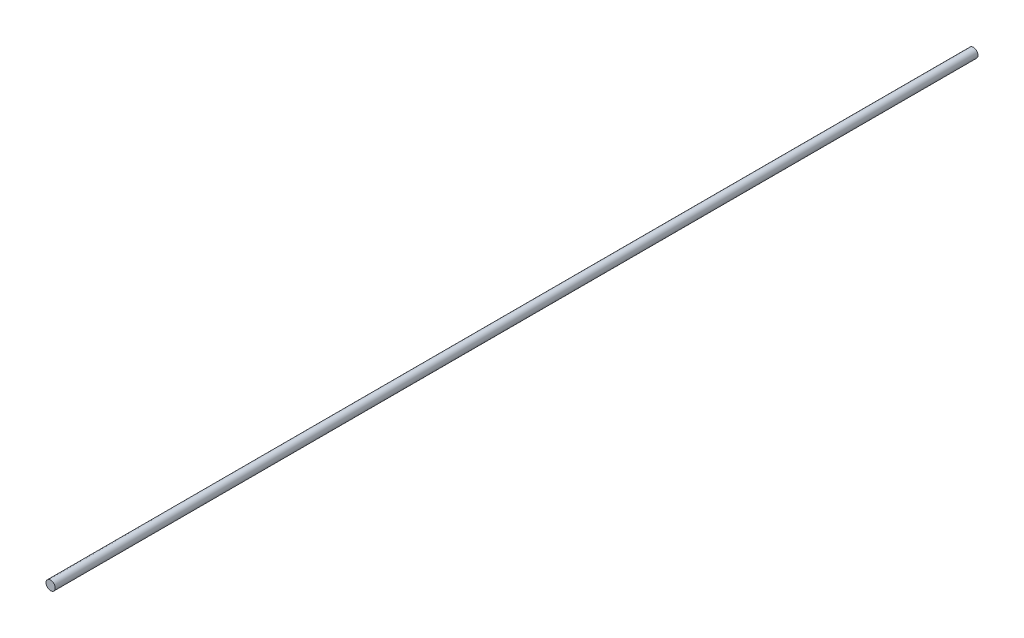
ISO-10303-21;
HEADER;
FILE_DESCRIPTION(('STEP AP214'),'2;1');
FILE_NAME('part.step','',(''),(''),'','','');
FILE_SCHEMA(('AUTOMOTIVE_DESIGN { 1 0 10303 214 1 1 1 1 }'));
ENDSEC;
DATA;
#1=APPLICATION_CONTEXT('core data for automotive mechanical design processes');
#2=APPLICATION_PROTOCOL_DEFINITION('international standard','automotive_design',2000,#1);
#3=PRODUCT_CONTEXT('',#1,'mechanical');
#4=PRODUCT('Part','Part','',(#3));
#5=PRODUCT_RELATED_PRODUCT_CATEGORY('part','',(#4));
#6=PRODUCT_DEFINITION_FORMATION('','',#4);
#7=PRODUCT_DEFINITION_CONTEXT('part definition',#1,'design');
#8=PRODUCT_DEFINITION('design','',#6,#7);
#9=PRODUCT_DEFINITION_SHAPE('','',#8);
#10=(LENGTH_UNIT() NAMED_UNIT(*) SI_UNIT(.MILLI.,.METRE.));
#11=(NAMED_UNIT(*) PLANE_ANGLE_UNIT() SI_UNIT($,.RADIAN.));
#12=(NAMED_UNIT(*) SI_UNIT($,.STERADIAN.) SOLID_ANGLE_UNIT());
#13=UNCERTAINTY_MEASURE_WITH_UNIT(LENGTH_MEASURE(1.E-05),#10,'distance_accuracy_value','');
#14=(GEOMETRIC_REPRESENTATION_CONTEXT(3) GLOBAL_UNCERTAINTY_ASSIGNED_CONTEXT((#13)) GLOBAL_UNIT_ASSIGNED_CONTEXT((#10,
#11,#12)) REPRESENTATION_CONTEXT('',''));
#15=CARTESIAN_POINT('',(0.,0.,0.));
#16=DIRECTION('',(0.,0.,1.));
#17=DIRECTION('',(1.,0.,0.));
#18=AXIS2_PLACEMENT_3D('',#15,#16,#17);
#19=CARTESIAN_POINT('',(0.,0.,1000.));
#20=DIRECTION('',(0.,0.,-1.));
#21=DIRECTION('',(-1.,0.,0.));
#22=AXIS2_PLACEMENT_3D('',#19,#20,#21);
#23=CYLINDRICAL_SURFACE('',#22,5.);
#24=CARTESIAN_POINT('',(0.,0.,1000.));
#25=DIRECTION('',(0.,0.,1.));
#26=DIRECTION('',(1.,0.,0.));
#27=AXIS2_PLACEMENT_3D('',#24,#25,#26);
#28=CIRCLE('',#27,5.);
#29=CARTESIAN_POINT('',(5.,0.,1000.));
#30=VERTEX_POINT('',#29);
#31=EDGE_CURVE('E10',#30,#30,#28,.T.);
#32=ORIENTED_EDGE('',*,*,#31,.F.);
#33=EDGE_LOOP('',(#32));
#34=FACE_BOUND('',#33,.T.);
#35=CARTESIAN_POINT('',(0.,0.,0.));
#36=DIRECTION('',(0.,0.,1.));
#37=DIRECTION('',(1.,0.,0.));
#38=AXIS2_PLACEMENT_3D('',#35,#36,#37);
#39=CIRCLE('',#38,5.);
#40=CARTESIAN_POINT('',(5.,0.,0.));
#41=VERTEX_POINT('',#40);
#42=EDGE_CURVE('E46',#41,#41,#39,.T.);
#43=ORIENTED_EDGE('',*,*,#42,.T.);
#44=EDGE_LOOP('',(#43));
#45=FACE_BOUND('',#44,.T.);
#46=ADVANCED_FACE('F43',(#34,#45),#23,.T.);
#47=CARTESIAN_POINT('',(0.,0.,1000.));
#48=DIRECTION('',(0.,0.,1.));
#49=DIRECTION('',(1.,0.,0.));
#50=AXIS2_PLACEMENT_3D('',#47,#48,#49);
#51=PLANE('',#50);
#52=ORIENTED_EDGE('',*,*,#31,.T.);
#53=EDGE_LOOP('',(#52));
#54=FACE_BOUND('',#53,.T.);
#55=ADVANCED_FACE('F60',(#54),#51,.T.);
#56=CARTESIAN_POINT('',(0.,0.,0.));
#57=DIRECTION('',(0.,0.,1.));
#58=DIRECTION('',(1.,0.,0.));
#59=AXIS2_PLACEMENT_3D('',#56,#57,#58);
#60=PLANE('',#59);
#61=ORIENTED_EDGE('',*,*,#42,.F.);
#62=EDGE_LOOP('',(#61));
#63=FACE_BOUND('',#62,.T.);
#64=ADVANCED_FACE('F58',(#63),#60,.F.);
#65=CLOSED_SHELL('',(#46,#55,#64));
#66=MANIFOLD_SOLID_BREP('B2',#65);
#67=ADVANCED_BREP_SHAPE_REPRESENTATION('',(#18,#66),#14);
#68=SHAPE_DEFINITION_REPRESENTATION(#9,#67);
ENDSEC;
END-ISO-10303-21;
